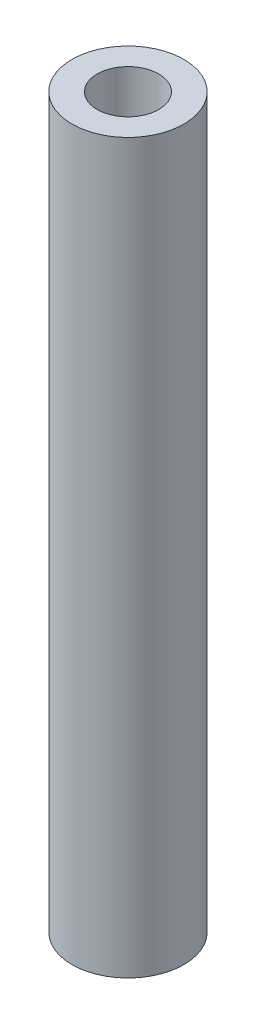
ISO-10303-21;
HEADER;
FILE_DESCRIPTION(('STEP AP214'),'2;1');
FILE_NAME('part.step','',(''),(''),'','','');
FILE_SCHEMA(('AUTOMOTIVE_DESIGN { 1 0 10303 214 1 1 1 1 }'));
ENDSEC;
DATA;
#1=APPLICATION_CONTEXT('core data for automotive mechanical design processes');
#2=APPLICATION_PROTOCOL_DEFINITION('international standard','automotive_design',2000,#1);
#3=PRODUCT_CONTEXT('',#1,'mechanical');
#4=PRODUCT('Part','Part','',(#3));
#5=PRODUCT_RELATED_PRODUCT_CATEGORY('part','',(#4));
#6=PRODUCT_DEFINITION_FORMATION('','',#4);
#7=PRODUCT_DEFINITION_CONTEXT('part definition',#1,'design');
#8=PRODUCT_DEFINITION('design','',#6,#7);
#9=PRODUCT_DEFINITION_SHAPE('','',#8);
#10=(LENGTH_UNIT() NAMED_UNIT(*) SI_UNIT(.MILLI.,.METRE.));
#11=(NAMED_UNIT(*) PLANE_ANGLE_UNIT() SI_UNIT($,.RADIAN.));
#12=(NAMED_UNIT(*) SI_UNIT($,.STERADIAN.) SOLID_ANGLE_UNIT());
#13=UNCERTAINTY_MEASURE_WITH_UNIT(LENGTH_MEASURE(1.E-05),#10,'distance_accuracy_value','');
#14=(GEOMETRIC_REPRESENTATION_CONTEXT(3) GLOBAL_UNCERTAINTY_ASSIGNED_CONTEXT((#13)) GLOBAL_UNIT_ASSIGNED_CONTEXT((#10,
#11,#12)) REPRESENTATION_CONTEXT('',''));
#15=CARTESIAN_POINT('',(0.,0.,0.));
#16=DIRECTION('',(0.,0.,1.));
#17=DIRECTION('',(1.,0.,0.));
#18=AXIS2_PLACEMENT_3D('',#15,#16,#17);
#19=CARTESIAN_POINT('',(0.,39.,0.));
#20=DIRECTION('',(0.,1.,0.));
#21=DIRECTION('',(0.,0.,1.));
#22=AXIS2_PLACEMENT_3D('',#19,#20,#21);
#23=PLANE('',#22);
#24=CARTESIAN_POINT('',(0.,39.,0.));
#25=DIRECTION('',(0.,1.,0.));
#26=DIRECTION('',(0.,0.,1.));
#27=AXIS2_PLACEMENT_3D('',#24,#25,#26);
#28=CIRCLE('',#27,3.);
#29=CARTESIAN_POINT('',(0.,39.,3.));
#30=VERTEX_POINT('',#29);
#31=EDGE_CURVE('E10',#30,#30,#28,.T.);
#32=ORIENTED_EDGE('',*,*,#31,.T.);
#33=EDGE_LOOP('',(#32));
#34=FACE_BOUND('',#33,.T.);
#35=CARTESIAN_POINT('',(0.,39.,0.));
#36=DIRECTION('',(0.,1.,0.));
#37=DIRECTION('',(0.,0.,1.));
#38=AXIS2_PLACEMENT_3D('',#35,#36,#37);
#39=CIRCLE('',#38,1.65);
#40=CARTESIAN_POINT('',(0.,39.,1.65));
#41=VERTEX_POINT('',#40);
#42=EDGE_CURVE('E43',#41,#41,#39,.T.);
#43=ORIENTED_EDGE('',*,*,#42,.F.);
#44=EDGE_LOOP('',(#43));
#45=FACE_BOUND('',#44,.T.);
#46=ADVANCED_FACE('F32',(#34,#45),#23,.T.);
#47=CARTESIAN_POINT('',(0.,0.,0.));
#48=DIRECTION('',(0.,1.,0.));
#49=DIRECTION('',(0.,0.,1.));
#50=AXIS2_PLACEMENT_3D('',#47,#48,#49);
#51=PLANE('',#50);
#52=CARTESIAN_POINT('',(0.,0.,0.));
#53=DIRECTION('',(0.,1.,0.));
#54=DIRECTION('',(0.,0.,1.));
#55=AXIS2_PLACEMENT_3D('',#52,#53,#54);
#56=CIRCLE('',#55,3.);
#57=CARTESIAN_POINT('',(0.,0.,3.));
#58=VERTEX_POINT('',#57);
#59=EDGE_CURVE('E36',#58,#58,#56,.T.);
#60=ORIENTED_EDGE('',*,*,#59,.F.);
#61=EDGE_LOOP('',(#60));
#62=FACE_BOUND('',#61,.T.);
#63=CARTESIAN_POINT('',(0.,0.,0.));
#64=DIRECTION('',(0.,1.,0.));
#65=DIRECTION('',(0.,0.,1.));
#66=AXIS2_PLACEMENT_3D('',#63,#64,#65);
#67=CIRCLE('',#66,1.65);
#68=CARTESIAN_POINT('',(0.,0.,1.65));
#69=VERTEX_POINT('',#68);
#70=EDGE_CURVE('E45',#69,#69,#67,.T.);
#71=ORIENTED_EDGE('',*,*,#70,.T.);
#72=EDGE_LOOP('',(#71));
#73=FACE_BOUND('',#72,.T.);
#74=ADVANCED_FACE('F55',(#62,#73),#51,.F.);
#75=CARTESIAN_POINT('',(0.,39.,0.));
#76=DIRECTION('',(0.,-1.,0.));
#77=DIRECTION('',(0.,0.,-1.));
#78=AXIS2_PLACEMENT_3D('',#75,#76,#77);
#79=CYLINDRICAL_SURFACE('',#78,3.);
#80=ORIENTED_EDGE('',*,*,#31,.F.);
#81=EDGE_LOOP('',(#80));
#82=FACE_BOUND('',#81,.T.);
#83=ORIENTED_EDGE('',*,*,#59,.T.);
#84=EDGE_LOOP('',(#83));
#85=FACE_BOUND('',#84,.T.);
#86=ADVANCED_FACE('F34',(#82,#85),#79,.T.);
#87=CARTESIAN_POINT('',(0.,39.,0.));
#88=DIRECTION('',(0.,-1.,0.));
#89=DIRECTION('',(0.,0.,-1.));
#90=AXIS2_PLACEMENT_3D('',#87,#88,#89);
#91=CYLINDRICAL_SURFACE('',#90,1.65);
#92=ORIENTED_EDGE('',*,*,#42,.T.);
#93=EDGE_LOOP('',(#92));
#94=FACE_BOUND('',#93,.T.);
#95=ORIENTED_EDGE('',*,*,#70,.F.);
#96=EDGE_LOOP('',(#95));
#97=FACE_BOUND('',#96,.T.);
#98=ADVANCED_FACE('F51',(#94,#97),#91,.F.);
#99=CLOSED_SHELL('',(#46,#74,#86,#98));
#100=MANIFOLD_SOLID_BREP('B2',#99);
#101=ADVANCED_BREP_SHAPE_REPRESENTATION('',(#18,#100),#14);
#102=SHAPE_DEFINITION_REPRESENTATION(#9,#101);
ENDSEC;
END-ISO-10303-21;
